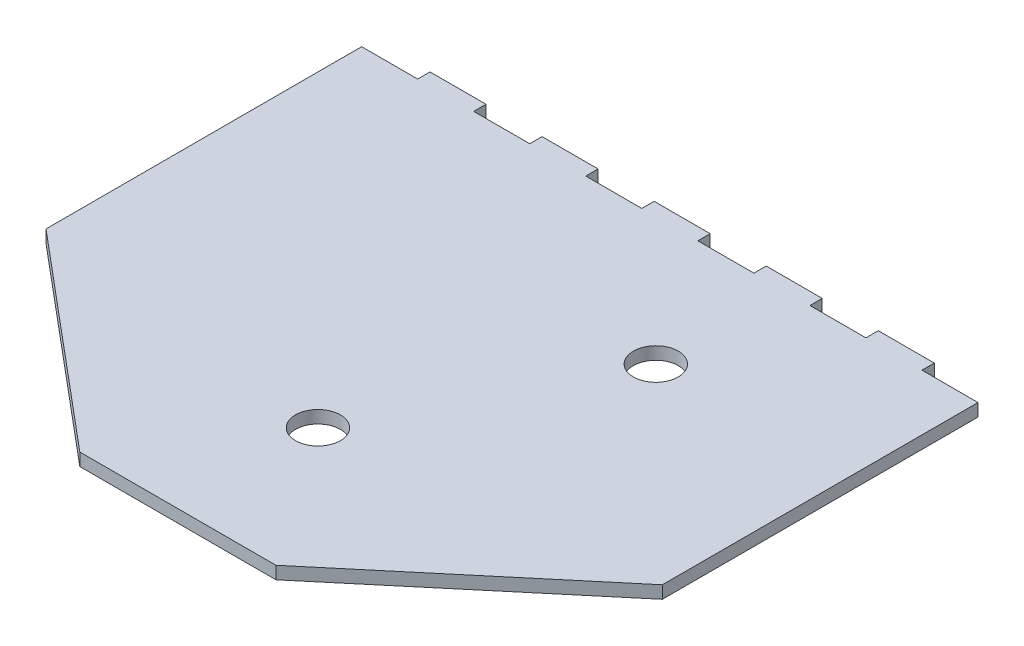
ISO-10303-21;
HEADER;
FILE_DESCRIPTION(('STEP AP214'),'2;1');
FILE_NAME('part.step','',(''),(''),'','','');
FILE_SCHEMA(('AUTOMOTIVE_DESIGN { 1 0 10303 214 1 1 1 1 }'));
ENDSEC;
DATA;
#1=APPLICATION_CONTEXT('core data for automotive mechanical design processes');
#2=APPLICATION_PROTOCOL_DEFINITION('international standard','automotive_design',2000,#1);
#3=PRODUCT_CONTEXT('',#1,'mechanical');
#4=PRODUCT('Part','Part','',(#3));
#5=PRODUCT_RELATED_PRODUCT_CATEGORY('part','',(#4));
#6=PRODUCT_DEFINITION_FORMATION('','',#4);
#7=PRODUCT_DEFINITION_CONTEXT('part definition',#1,'design');
#8=PRODUCT_DEFINITION('design','',#6,#7);
#9=PRODUCT_DEFINITION_SHAPE('','',#8);
#10=(LENGTH_UNIT() NAMED_UNIT(*) SI_UNIT(.MILLI.,.METRE.));
#11=(NAMED_UNIT(*) PLANE_ANGLE_UNIT() SI_UNIT($,.RADIAN.));
#12=(NAMED_UNIT(*) SI_UNIT($,.STERADIAN.) SOLID_ANGLE_UNIT());
#13=UNCERTAINTY_MEASURE_WITH_UNIT(LENGTH_MEASURE(1.E-05),#10,'distance_accuracy_value','');
#14=(GEOMETRIC_REPRESENTATION_CONTEXT(3) GLOBAL_UNCERTAINTY_ASSIGNED_CONTEXT((#13)) GLOBAL_UNIT_ASSIGNED_CONTEXT((#10,
#11,#12)) REPRESENTATION_CONTEXT('',''));
#15=CARTESIAN_POINT('',(0.,0.,0.));
#16=DIRECTION('',(0.,0.,1.));
#17=DIRECTION('',(1.,0.,0.));
#18=AXIS2_PLACEMENT_3D('',#15,#16,#17);
#19=CARTESIAN_POINT('',(110.,4.5,-90.));
#20=DIRECTION('',(0.,0.,1.));
#21=DIRECTION('',(1.,0.,0.));
#22=AXIS2_PLACEMENT_3D('',#19,#20,#21);
#23=PLANE('',#22);
#24=DIRECTION('',(-1.,0.,0.));
#25=VECTOR('',#24,1.);
#26=CARTESIAN_POINT('',(110.,4.5,-90.));
#27=LINE('',#26,#25);
#28=CARTESIAN_POINT('',(-70.,4.5,-90.0000000000003));
#29=VERTEX_POINT('',#28);
#30=CARTESIAN_POINT('',(-90.,4.5,-90.));
#31=VERTEX_POINT('',#30);
#32=EDGE_CURVE('E242',#29,#31,#27,.T.);
#33=ORIENTED_EDGE('',*,*,#32,.F.);
#34=DIRECTION('',(0.,-1.,0.));
#35=VECTOR('',#34,1.);
#36=CARTESIAN_POINT('',(-70.,4.5,-90.0000000000003));
#37=LINE('',#36,#35);
#38=CARTESIAN_POINT('',(-70.,0.,-90.0000000000003));
#39=VERTEX_POINT('',#38);
#40=EDGE_CURVE('E337',#29,#39,#37,.T.);
#41=ORIENTED_EDGE('',*,*,#40,.T.);
#42=DIRECTION('',(-1.,0.,0.));
#43=VECTOR('',#42,1.);
#44=CARTESIAN_POINT('',(110.,0.,-90.));
#45=LINE('',#44,#43);
#46=CARTESIAN_POINT('',(-90.,0.,-90.));
#47=VERTEX_POINT('',#46);
#48=EDGE_CURVE('E260',#39,#47,#45,.T.);
#49=ORIENTED_EDGE('',*,*,#48,.T.);
#50=DIRECTION('',(0.,-1.,0.));
#51=VECTOR('',#50,1.);
#52=CARTESIAN_POINT('',(-90.,4.5,-90.));
#53=LINE('',#52,#51);
#54=EDGE_CURVE('E409',#31,#47,#53,.T.);
#55=ORIENTED_EDGE('',*,*,#54,.F.);
#56=EDGE_LOOP('',(#33,#41,#49,#55));
#57=FACE_BOUND('',#56,.T.);
#58=ADVANCED_FACE('F41',(#57),#23,.F.);
#59=CARTESIAN_POINT('',(50.,0.,-90.0000000000003));
#60=VERTEX_POINT('',#59);
#61=CARTESIAN_POINT('',(30.,0.,-90.0000000000005));
#62=VERTEX_POINT('',#61);
#63=EDGE_CURVE('E435',#60,#62,#45,.T.);
#64=ORIENTED_EDGE('',*,*,#63,.T.);
#65=DIRECTION('',(0.,-1.,0.));
#66=VECTOR('',#65,1.);
#67=CARTESIAN_POINT('',(30.,4.5,-90.0000000000005));
#68=LINE('',#67,#66);
#69=CARTESIAN_POINT('',(30.,4.5,-90.0000000000005));
#70=VERTEX_POINT('',#69);
#71=EDGE_CURVE('E319',#70,#62,#68,.T.);
#72=ORIENTED_EDGE('',*,*,#71,.F.);
#73=CARTESIAN_POINT('',(50.,4.5,-90.0000000000003));
#74=VERTEX_POINT('',#73);
#75=EDGE_CURVE('E465',#74,#70,#27,.T.);
#76=ORIENTED_EDGE('',*,*,#75,.F.);
#77=DIRECTION('',(0.,-1.,0.));
#78=VECTOR('',#77,1.);
#79=CARTESIAN_POINT('',(50.,4.5,-90.0000000000003));
#80=LINE('',#79,#78);
#81=EDGE_CURVE('E391',#74,#60,#80,.T.);
#82=ORIENTED_EDGE('',*,*,#81,.T.);
#83=EDGE_LOOP('',(#64,#72,#76,#82));
#84=FACE_BOUND('',#83,.T.);
#85=ADVANCED_FACE('F480',(#84),#23,.F.);
#86=CARTESIAN_POINT('',(90.,4.5,-90.));
#87=VERTEX_POINT('',#86);
#88=CARTESIAN_POINT('',(70.,4.5,-90.0000000000003));
#89=VERTEX_POINT('',#88);
#90=EDGE_CURVE('E248',#87,#89,#27,.T.);
#91=ORIENTED_EDGE('',*,*,#90,.F.);
#92=DIRECTION('',(0.,-1.,0.));
#93=VECTOR('',#92,1.);
#94=CARTESIAN_POINT('',(90.,4.5,-90.));
#95=LINE('',#94,#93);
#96=CARTESIAN_POINT('',(90.,0.,-90.));
#97=VERTEX_POINT('',#96);
#98=EDGE_CURVE('E306',#87,#97,#95,.T.);
#99=ORIENTED_EDGE('',*,*,#98,.T.);
#100=CARTESIAN_POINT('',(70.,0.,-90.0000000000003));
#101=VERTEX_POINT('',#100);
#102=EDGE_CURVE('E264',#97,#101,#45,.T.);
#103=ORIENTED_EDGE('',*,*,#102,.T.);
#104=DIRECTION('',(0.,-1.,0.));
#105=VECTOR('',#104,1.);
#106=CARTESIAN_POINT('',(70.,4.5,-90.0000000000003));
#107=LINE('',#106,#105);
#108=EDGE_CURVE('E329',#89,#101,#107,.T.);
#109=ORIENTED_EDGE('',*,*,#108,.F.);
#110=EDGE_LOOP('',(#91,#99,#103,#109));
#111=FACE_BOUND('',#110,.T.);
#112=ADVANCED_FACE('F471',(#111),#23,.F.);
#113=CARTESIAN_POINT('',(-30.,0.,-90.0000000000005));
#114=VERTEX_POINT('',#113);
#115=CARTESIAN_POINT('',(-50.,0.,-90.));
#116=VERTEX_POINT('',#115);
#117=EDGE_CURVE('E263',#114,#116,#45,.T.);
#118=ORIENTED_EDGE('',*,*,#117,.T.);
#119=DIRECTION('',(0.,-1.,0.));
#120=VECTOR('',#119,1.);
#121=CARTESIAN_POINT('',(-50.,4.5,-90.0000000000003));
#122=LINE('',#121,#120);
#123=CARTESIAN_POINT('',(-50.,4.5,-90.0000000000003));
#124=VERTEX_POINT('',#123);
#125=EDGE_CURVE('E341',#124,#116,#122,.T.);
#126=ORIENTED_EDGE('',*,*,#125,.F.);
#127=CARTESIAN_POINT('',(-30.,4.5,-90.0000000000005));
#128=VERTEX_POINT('',#127);
#129=EDGE_CURVE('E246',#128,#124,#27,.T.);
#130=ORIENTED_EDGE('',*,*,#129,.F.);
#131=DIRECTION('',(0.,-1.,0.));
#132=VECTOR('',#131,1.);
#133=CARTESIAN_POINT('',(-30.,4.5,-90.0000000000005));
#134=LINE('',#133,#132);
#135=EDGE_CURVE('E363',#128,#114,#134,.T.);
#136=ORIENTED_EDGE('',*,*,#135,.T.);
#137=EDGE_LOOP('',(#118,#126,#130,#136));
#138=FACE_BOUND('',#137,.T.);
#139=ADVANCED_FACE('F451',(#138),#23,.F.);
#140=CARTESIAN_POINT('',(-110.,4.5,-90.));
#141=DIRECTION('',(1.,0.,0.));
#142=DIRECTION('',(0.,0.,-1.));
#143=AXIS2_PLACEMENT_3D('',#140,#141,#142);
#144=PLANE('',#143);
#145=DIRECTION('',(0.,0.,1.));
#146=VECTOR('',#145,1.);
#147=CARTESIAN_POINT('',(-110.,4.5,-90.));
#148=LINE('',#147,#146);
#149=CARTESIAN_POINT('',(-110.,4.5,-85.6));
#150=VERTEX_POINT('',#149);
#151=CARTESIAN_POINT('',(-110.,4.5,27.067527661704));
#152=VERTEX_POINT('',#151);
#153=EDGE_CURVE('E249',#150,#152,#148,.T.);
#154=ORIENTED_EDGE('',*,*,#153,.F.);
#155=DIRECTION('',(0.,-1.,0.));
#156=VECTOR('',#155,1.);
#157=CARTESIAN_POINT('',(-110.,4.5,-85.6));
#158=LINE('',#157,#156);
#159=CARTESIAN_POINT('',(-110.,0.,-85.6));
#160=VERTEX_POINT('',#159);
#161=EDGE_CURVE('E414',#150,#160,#158,.T.);
#162=ORIENTED_EDGE('',*,*,#161,.T.);
#163=DIRECTION('',(0.,0.,1.));
#164=VECTOR('',#163,1.);
#165=CARTESIAN_POINT('',(-110.,0.,-90.));
#166=LINE('',#165,#164);
#167=CARTESIAN_POINT('',(-110.,0.,27.067527661704));
#168=VERTEX_POINT('',#167);
#169=EDGE_CURVE('E253',#160,#168,#166,.T.);
#170=ORIENTED_EDGE('',*,*,#169,.T.);
#171=DIRECTION('',(0.,1.,0.));
#172=VECTOR('',#171,1.);
#173=CARTESIAN_POINT('',(-110.,4.5,27.067527661704));
#174=LINE('',#173,#172);
#175=EDGE_CURVE('E275',#168,#152,#174,.T.);
#176=ORIENTED_EDGE('',*,*,#175,.T.);
#177=EDGE_LOOP('',(#154,#162,#170,#176));
#178=FACE_BOUND('',#177,.T.);
#179=ADVANCED_FACE('F528',(#178),#144,.F.);
#180=CARTESIAN_POINT('',(110.,4.5,90.));
#181=DIRECTION('',(0.,0.,-1.));
#182=DIRECTION('',(-1.,0.,0.));
#183=AXIS2_PLACEMENT_3D('',#180,#181,#182);
#184=PLANE('',#183);
#185=DIRECTION('',(1.,0.,0.));
#186=VECTOR('',#185,1.);
#187=CARTESIAN_POINT('',(110.,4.5,90.));
#188=LINE('',#187,#186);
#189=CARTESIAN_POINT('',(-34.9999999999996,4.5,90.));
#190=VERTEX_POINT('',#189);
#191=CARTESIAN_POINT('',(34.9999999999998,4.5,90.));
#192=VERTEX_POINT('',#191);
#193=EDGE_CURVE('E243',#190,#192,#188,.T.);
#194=ORIENTED_EDGE('',*,*,#193,.F.);
#195=DIRECTION('',(0.,-1.,0.));
#196=VECTOR('',#195,1.);
#197=CARTESIAN_POINT('',(-34.9999999999996,4.5,90.));
#198=LINE('',#197,#196);
#199=CARTESIAN_POINT('',(-34.9999999999996,0.,90.));
#200=VERTEX_POINT('',#199);
#201=EDGE_CURVE('E267',#190,#200,#198,.T.);
#202=ORIENTED_EDGE('',*,*,#201,.T.);
#203=DIRECTION('',(1.,0.,0.));
#204=VECTOR('',#203,1.);
#205=CARTESIAN_POINT('',(110.,0.,90.));
#206=LINE('',#205,#204);
#207=CARTESIAN_POINT('',(34.9999999999998,0.,90.));
#208=VERTEX_POINT('',#207);
#209=EDGE_CURVE('E255',#200,#208,#206,.T.);
#210=ORIENTED_EDGE('',*,*,#209,.T.);
#211=DIRECTION('',(0.,1.,0.));
#212=VECTOR('',#211,1.);
#213=CARTESIAN_POINT('',(34.9999999999998,4.5,90.));
#214=LINE('',#213,#212);
#215=EDGE_CURVE('E265',#208,#192,#214,.T.);
#216=ORIENTED_EDGE('',*,*,#215,.T.);
#217=EDGE_LOOP('',(#194,#202,#210,#216));
#218=FACE_BOUND('',#217,.T.);
#219=ADVANCED_FACE('F286',(#218),#184,.F.);
#220=CARTESIAN_POINT('',(110.,4.5,-90.));
#221=DIRECTION('',(-1.,0.,0.));
#222=DIRECTION('',(0.,0.,1.));
#223=AXIS2_PLACEMENT_3D('',#220,#221,#222);
#224=PLANE('',#223);
#225=DIRECTION('',(0.,0.,-1.));
#226=VECTOR('',#225,1.);
#227=CARTESIAN_POINT('',(110.,0.,-90.));
#228=LINE('',#227,#226);
#229=CARTESIAN_POINT('',(110.,0.,27.067527661704));
#230=VERTEX_POINT('',#229);
#231=CARTESIAN_POINT('',(110.,0.,-85.6));
#232=VERTEX_POINT('',#231);
#233=EDGE_CURVE('E235',#230,#232,#228,.T.);
#234=ORIENTED_EDGE('',*,*,#233,.T.);
#235=DIRECTION('',(0.,-1.,0.));
#236=VECTOR('',#235,1.);
#237=CARTESIAN_POINT('',(110.,4.5,-85.6));
#238=LINE('',#237,#236);
#239=CARTESIAN_POINT('',(110.,4.5,-85.6));
#240=VERTEX_POINT('',#239);
#241=EDGE_CURVE('E218',#240,#232,#238,.T.);
#242=ORIENTED_EDGE('',*,*,#241,.F.);
#243=DIRECTION('',(0.,0.,-1.));
#244=VECTOR('',#243,1.);
#245=CARTESIAN_POINT('',(110.,4.5,-90.));
#246=LINE('',#245,#244);
#247=CARTESIAN_POINT('',(110.,4.5,27.067527661704));
#248=VERTEX_POINT('',#247);
#249=EDGE_CURVE('E232',#248,#240,#246,.T.);
#250=ORIENTED_EDGE('',*,*,#249,.F.);
#251=DIRECTION('',(0.,-1.,0.));
#252=VECTOR('',#251,1.);
#253=CARTESIAN_POINT('',(110.,4.5,27.067527661704));
#254=LINE('',#253,#252);
#255=EDGE_CURVE('E11',#248,#230,#254,.T.);
#256=ORIENTED_EDGE('',*,*,#255,.T.);
#257=EDGE_LOOP('',(#234,#242,#250,#256));
#258=FACE_BOUND('',#257,.T.);
#259=ADVANCED_FACE('F231',(#258),#224,.F.);
#260=CARTESIAN_POINT('',(9.99999999999998,4.5,-90.0000000000005));
#261=VERTEX_POINT('',#260);
#262=CARTESIAN_POINT('',(-9.99999999999998,4.5,-90.0000000000005));
#263=VERTEX_POINT('',#262);
#264=EDGE_CURVE('E463',#261,#263,#27,.T.);
#265=ORIENTED_EDGE('',*,*,#264,.F.);
#266=DIRECTION('',(0.,-1.,0.));
#267=VECTOR('',#266,1.);
#268=CARTESIAN_POINT('',(9.99999999999998,4.5,-90.0000000000005));
#269=LINE('',#268,#267);
#270=CARTESIAN_POINT('',(9.99999999999998,0.,-90.0000000000005));
#271=VERTEX_POINT('',#270);
#272=EDGE_CURVE('E316',#261,#271,#269,.T.);
#273=ORIENTED_EDGE('',*,*,#272,.T.);
#274=CARTESIAN_POINT('',(-9.99999999999998,0.,-90.));
#275=VERTEX_POINT('',#274);
#276=EDGE_CURVE('E439',#271,#275,#45,.T.);
#277=ORIENTED_EDGE('',*,*,#276,.T.);
#278=DIRECTION('',(0.,-1.,0.));
#279=VECTOR('',#278,1.);
#280=CARTESIAN_POINT('',(-9.99999999999998,4.5,-90.0000000000005));
#281=LINE('',#280,#279);
#282=EDGE_CURVE('E367',#263,#275,#281,.T.);
#283=ORIENTED_EDGE('',*,*,#282,.F.);
#284=EDGE_LOOP('',(#265,#273,#277,#283));
#285=FACE_BOUND('',#284,.T.);
#286=ADVANCED_FACE('F489',(#285),#23,.F.);
#287=CARTESIAN_POINT('',(0.,4.5,0.));
#288=DIRECTION('',(0.,-1.,0.));
#289=DIRECTION('',(0.,0.,-1.));
#290=AXIS2_PLACEMENT_3D('',#287,#288,#289);
#291=PLANE('',#290);
#292=DIRECTION('',(-1.,0.,0.));
#293=VECTOR('',#292,1.);
#294=CARTESIAN_POINT('',(110.,4.5,-85.6));
#295=LINE('',#294,#293);
#296=CARTESIAN_POINT('',(90.,4.5,-85.6));
#297=VERTEX_POINT('',#296);
#298=EDGE_CURVE('E214',#240,#297,#295,.T.);
#299=ORIENTED_EDGE('',*,*,#298,.T.);
#300=DIRECTION('',(0.,0.,-1.));
#301=VECTOR('',#300,1.);
#302=CARTESIAN_POINT('',(90.,4.5,-90.));
#303=LINE('',#302,#301);
#304=EDGE_CURVE('E225',#297,#87,#303,.T.);
#305=ORIENTED_EDGE('',*,*,#304,.T.);
#306=ORIENTED_EDGE('',*,*,#90,.T.);
#307=DIRECTION('',(0.,0.,1.));
#308=VECTOR('',#307,1.);
#309=CARTESIAN_POINT('',(70.,4.5,-90.0000000000003));
#310=LINE('',#309,#308);
#311=CARTESIAN_POINT('',(70.,4.5,-85.6000000000001));
#312=VERTEX_POINT('',#311);
#313=EDGE_CURVE('E398',#89,#312,#310,.T.);
#314=ORIENTED_EDGE('',*,*,#313,.T.);
#315=DIRECTION('',(-1.,0.,0.));
#316=VECTOR('',#315,1.);
#317=CARTESIAN_POINT('',(70.,4.5,-85.6000000000001));
#318=LINE('',#317,#316);
#319=CARTESIAN_POINT('',(50.,4.5,-85.6000000000003));
#320=VERTEX_POINT('',#319);
#321=EDGE_CURVE('E404',#312,#320,#318,.T.);
#322=ORIENTED_EDGE('',*,*,#321,.T.);
#323=DIRECTION('',(0.,0.,-1.));
#324=VECTOR('',#323,1.);
#325=CARTESIAN_POINT('',(50.,4.5,-90.0000000000003));
#326=LINE('',#325,#324);
#327=EDGE_CURVE('E388',#320,#74,#326,.T.);
#328=ORIENTED_EDGE('',*,*,#327,.T.);
#329=ORIENTED_EDGE('',*,*,#75,.T.);
#330=DIRECTION('',(0.,0.,1.));
#331=VECTOR('',#330,1.);
#332=CARTESIAN_POINT('',(30.,4.5,-90.0000000000005));
#333=LINE('',#332,#331);
#334=CARTESIAN_POINT('',(30.,4.5,-85.6000000000005));
#335=VERTEX_POINT('',#334);
#336=EDGE_CURVE('E325',#70,#335,#333,.T.);
#337=ORIENTED_EDGE('',*,*,#336,.T.);
#338=DIRECTION('',(-1.,0.,0.));
#339=VECTOR('',#338,1.);
#340=CARTESIAN_POINT('',(30.,4.5,-85.6000000000005));
#341=LINE('',#340,#339);
#342=CARTESIAN_POINT('',(9.99999999999998,4.5,-85.6000000000006));
#343=VERTEX_POINT('',#342);
#344=EDGE_CURVE('E332',#335,#343,#341,.T.);
#345=ORIENTED_EDGE('',*,*,#344,.T.);
#346=DIRECTION('',(0.,0.,-1.));
#347=VECTOR('',#346,1.);
#348=CARTESIAN_POINT('',(9.99999999999998,4.5,-90.0000000000005));
#349=LINE('',#348,#347);
#350=EDGE_CURVE('E313',#343,#261,#349,.T.);
#351=ORIENTED_EDGE('',*,*,#350,.T.);
#352=ORIENTED_EDGE('',*,*,#264,.T.);
#353=DIRECTION('',(0.,0.,1.));
#354=VECTOR('',#353,1.);
#355=CARTESIAN_POINT('',(-9.99999999999998,4.5,-90.0000000000005));
#356=LINE('',#355,#354);
#357=CARTESIAN_POINT('',(-9.99999999999998,4.5,-85.6000000000006));
#358=VERTEX_POINT('',#357);
#359=EDGE_CURVE('E381',#263,#358,#356,.T.);
#360=ORIENTED_EDGE('',*,*,#359,.T.);
#361=DIRECTION('',(-1.,0.,0.));
#362=VECTOR('',#361,1.);
#363=CARTESIAN_POINT('',(-30.,4.5,-85.6000000000005));
#364=LINE('',#363,#362);
#365=CARTESIAN_POINT('',(-30.,4.5,-85.6000000000005));
#366=VERTEX_POINT('',#365);
#367=EDGE_CURVE('E366',#358,#366,#364,.T.);
#368=ORIENTED_EDGE('',*,*,#367,.T.);
#369=DIRECTION('',(0.,0.,-1.));
#370=VECTOR('',#369,1.);
#371=CARTESIAN_POINT('',(-30.,4.5,-90.0000000000005));
#372=LINE('',#371,#370);
#373=EDGE_CURVE('E376',#366,#128,#372,.T.);
#374=ORIENTED_EDGE('',*,*,#373,.T.);
#375=ORIENTED_EDGE('',*,*,#129,.T.);
#376=DIRECTION('',(0.,0.,1.));
#377=VECTOR('',#376,1.);
#378=CARTESIAN_POINT('',(-50.,4.5,-90.0000000000003));
#379=LINE('',#378,#377);
#380=CARTESIAN_POINT('',(-50.,4.5,-85.6000000000003));
#381=VERTEX_POINT('',#380);
#382=EDGE_CURVE('E358',#124,#381,#379,.T.);
#383=ORIENTED_EDGE('',*,*,#382,.T.);
#384=DIRECTION('',(-1.,0.,0.));
#385=VECTOR('',#384,1.);
#386=CARTESIAN_POINT('',(-70.,4.5,-85.6000000000001));
#387=LINE('',#386,#385);
#388=CARTESIAN_POINT('',(-70.,4.5,-85.6000000000001));
#389=VERTEX_POINT('',#388);
#390=EDGE_CURVE('E340',#381,#389,#387,.T.);
#391=ORIENTED_EDGE('',*,*,#390,.T.);
#392=DIRECTION('',(0.,0.,-1.));
#393=VECTOR('',#392,1.);
#394=CARTESIAN_POINT('',(-70.,4.5,-90.0000000000003));
#395=LINE('',#394,#393);
#396=EDGE_CURVE('E352',#389,#29,#395,.T.);
#397=ORIENTED_EDGE('',*,*,#396,.T.);
#398=ORIENTED_EDGE('',*,*,#32,.T.);
#399=DIRECTION('',(0.,0.,1.));
#400=VECTOR('',#399,1.);
#401=CARTESIAN_POINT('',(-90.,4.5,-90.));
#402=LINE('',#401,#400);
#403=CARTESIAN_POINT('',(-90.,4.5,-85.6));
#404=VERTEX_POINT('',#403);
#405=EDGE_CURVE('E419',#31,#404,#402,.T.);
#406=ORIENTED_EDGE('',*,*,#405,.T.);
#407=DIRECTION('',(-1.,0.,0.));
#408=VECTOR('',#407,1.);
#409=CARTESIAN_POINT('',(-110.,4.5,-85.6));
#410=LINE('',#409,#408);
#411=EDGE_CURVE('E411',#404,#150,#410,.T.);
#412=ORIENTED_EDGE('',*,*,#411,.T.);
#413=ORIENTED_EDGE('',*,*,#153,.T.);
#414=DIRECTION('',(-0.76604444311898,0.,-0.642787609686537));
#415=VECTOR('',#414,1.);
#416=CARTESIAN_POINT('',(-34.9999999999996,4.5,90.));
#417=LINE('',#416,#415);
#418=EDGE_CURVE('E50',#152,#190,#417,.F.);
#419=ORIENTED_EDGE('',*,*,#418,.T.);
#420=ORIENTED_EDGE('',*,*,#193,.T.);
#421=DIRECTION('',(-0.766044443118979,0.,0.642787609686538));
#422=VECTOR('',#421,1.);
#423=CARTESIAN_POINT('',(110.,4.5,27.067527661704));
#424=LINE('',#423,#422);
#425=EDGE_CURVE('E241',#192,#248,#424,.F.);
#426=ORIENTED_EDGE('',*,*,#425,.T.);
#427=ORIENTED_EDGE('',*,*,#249,.T.);
#428=EDGE_LOOP('',(#299,#305,#306,#314,#322,#328,#329,#337,#345,#351,#352,#360,#368,#374,#375,
#383,#391,#397,#398,#406,#412,#413,#419,#420,#426,#427));
#429=FACE_BOUND('',#428,.T.);
#430=CARTESIAN_POINT('',(0.,4.5,40.));
#431=DIRECTION('',(0.,1.,0.));
#432=DIRECTION('',(0.,0.,1.));
#433=AXIS2_PLACEMENT_3D('',#430,#431,#432);
#434=CIRCLE('',#433,8.);
#435=CARTESIAN_POINT('',(0.,4.5,48.));
#436=VERTEX_POINT('',#435);
#437=EDGE_CURVE('E427',#436,#436,#434,.T.);
#438=ORIENTED_EDGE('',*,*,#437,.F.);
#439=EDGE_LOOP('',(#438));
#440=FACE_BOUND('',#439,.T.);
#441=CARTESIAN_POINT('',(40.6,4.5,-40.));
#442=DIRECTION('',(0.,1.,0.));
#443=DIRECTION('',(0.,0.,1.));
#444=AXIS2_PLACEMENT_3D('',#441,#442,#443);
#445=CIRCLE('',#444,8.);
#446=CARTESIAN_POINT('',(40.6,4.5,-32.));
#447=VERTEX_POINT('',#446);
#448=EDGE_CURVE('E430',#447,#447,#445,.T.);
#449=ORIENTED_EDGE('',*,*,#448,.F.);
#450=EDGE_LOOP('',(#449));
#451=FACE_BOUND('',#450,.T.);
#452=ADVANCED_FACE('F237',(#429,#440,#451),#291,.F.);
#453=CARTESIAN_POINT('',(0.,0.,0.));
#454=DIRECTION('',(0.,-1.,0.));
#455=DIRECTION('',(0.,0.,-1.));
#456=AXIS2_PLACEMENT_3D('',#453,#454,#455);
#457=PLANE('',#456);
#458=DIRECTION('',(0.,0.,-1.));
#459=VECTOR('',#458,1.);
#460=CARTESIAN_POINT('',(90.,0.,-90.));
#461=LINE('',#460,#459);
#462=CARTESIAN_POINT('',(90.,0.,-85.6));
#463=VERTEX_POINT('',#462);
#464=EDGE_CURVE('E226',#463,#97,#461,.T.);
#465=ORIENTED_EDGE('',*,*,#464,.F.);
#466=DIRECTION('',(-1.,0.,0.));
#467=VECTOR('',#466,1.);
#468=CARTESIAN_POINT('',(110.,0.,-85.6));
#469=LINE('',#468,#467);
#470=EDGE_CURVE('E297',#232,#463,#469,.T.);
#471=ORIENTED_EDGE('',*,*,#470,.F.);
#472=ORIENTED_EDGE('',*,*,#233,.F.);
#473=DIRECTION('',(0.766044443118979,0.,-0.642787609686538));
#474=VECTOR('',#473,1.);
#475=CARTESIAN_POINT('',(58.7775057763779,0.,70.0483036727255));
#476=LINE('',#475,#474);
#477=EDGE_CURVE('E270',#230,#208,#476,.F.);
#478=ORIENTED_EDGE('',*,*,#477,.T.);
#479=ORIENTED_EDGE('',*,*,#209,.F.);
#480=DIRECTION('',(0.76604444311898,0.,0.642787609686537));
#481=VECTOR('',#480,1.);
#482=CARTESIAN_POINT('',(-58.7775057763778,0.,70.0483036727255));
#483=LINE('',#482,#481);
#484=EDGE_CURVE('E272',#200,#168,#483,.F.);
#485=ORIENTED_EDGE('',*,*,#484,.T.);
#486=ORIENTED_EDGE('',*,*,#169,.F.);
#487=DIRECTION('',(-1.,0.,0.));
#488=VECTOR('',#487,1.);
#489=CARTESIAN_POINT('',(-110.,0.,-85.6));
#490=LINE('',#489,#488);
#491=CARTESIAN_POINT('',(-90.,0.,-85.6));
#492=VERTEX_POINT('',#491);
#493=EDGE_CURVE('E417',#492,#160,#490,.T.);
#494=ORIENTED_EDGE('',*,*,#493,.F.);
#495=DIRECTION('',(0.,0.,1.));
#496=VECTOR('',#495,1.);
#497=CARTESIAN_POINT('',(-90.,0.,-90.));
#498=LINE('',#497,#496);
#499=EDGE_CURVE('E347',#47,#492,#498,.T.);
#500=ORIENTED_EDGE('',*,*,#499,.F.);
#501=ORIENTED_EDGE('',*,*,#48,.F.);
#502=DIRECTION('',(0.,0.,-1.));
#503=VECTOR('',#502,1.);
#504=CARTESIAN_POINT('',(-70.,0.,-90.0000000000003));
#505=LINE('',#504,#503);
#506=CARTESIAN_POINT('',(-70.,0.,-85.6000000000001));
#507=VERTEX_POINT('',#506);
#508=EDGE_CURVE('E321',#507,#39,#505,.T.);
#509=ORIENTED_EDGE('',*,*,#508,.F.);
#510=DIRECTION('',(-1.,0.,0.));
#511=VECTOR('',#510,1.);
#512=CARTESIAN_POINT('',(-70.,0.,-85.6000000000001));
#513=LINE('',#512,#511);
#514=CARTESIAN_POINT('',(-50.,0.,-85.6000000000003));
#515=VERTEX_POINT('',#514);
#516=EDGE_CURVE('E348',#515,#507,#513,.T.);
#517=ORIENTED_EDGE('',*,*,#516,.F.);
#518=DIRECTION('',(0.,0.,1.));
#519=VECTOR('',#518,1.);
#520=CARTESIAN_POINT('',(-50.,0.,-90.0000000000003));
#521=LINE('',#520,#519);
#522=EDGE_CURVE('E351',#116,#515,#521,.T.);
#523=ORIENTED_EDGE('',*,*,#522,.F.);
#524=ORIENTED_EDGE('',*,*,#117,.F.);
#525=DIRECTION('',(0.,0.,-1.));
#526=VECTOR('',#525,1.);
#527=CARTESIAN_POINT('',(-30.,0.,-90.0000000000005));
#528=LINE('',#527,#526);
#529=CARTESIAN_POINT('',(-30.,0.,-85.6000000000005));
#530=VERTEX_POINT('',#529);
#531=EDGE_CURVE('E299',#530,#114,#528,.T.);
#532=ORIENTED_EDGE('',*,*,#531,.F.);
#533=DIRECTION('',(-1.,0.,0.));
#534=VECTOR('',#533,1.);
#535=CARTESIAN_POINT('',(-30.,0.,-85.6000000000005));
#536=LINE('',#535,#534);
#537=CARTESIAN_POINT('',(-9.99999999999998,0.,-85.6000000000006));
#538=VERTEX_POINT('',#537);
#539=EDGE_CURVE('E373',#538,#530,#536,.T.);
#540=ORIENTED_EDGE('',*,*,#539,.F.);
#541=DIRECTION('',(0.,0.,1.));
#542=VECTOR('',#541,1.);
#543=CARTESIAN_POINT('',(-9.99999999999998,0.,-90.0000000000005));
#544=LINE('',#543,#542);
#545=EDGE_CURVE('E302',#275,#538,#544,.T.);
#546=ORIENTED_EDGE('',*,*,#545,.F.);
#547=ORIENTED_EDGE('',*,*,#276,.F.);
#548=DIRECTION('',(0.,0.,-1.));
#549=VECTOR('',#548,1.);
#550=CARTESIAN_POINT('',(9.99999999999998,0.,-90.0000000000005));
#551=LINE('',#550,#549);
#552=CARTESIAN_POINT('',(9.99999999999998,0.,-85.6000000000006));
#553=VERTEX_POINT('',#552);
#554=EDGE_CURVE('E322',#553,#271,#551,.T.);
#555=ORIENTED_EDGE('',*,*,#554,.F.);
#556=DIRECTION('',(-1.,0.,0.));
#557=VECTOR('',#556,1.);
#558=CARTESIAN_POINT('',(30.,0.,-85.6000000000005));
#559=LINE('',#558,#557);
#560=CARTESIAN_POINT('',(30.,0.,-85.6000000000005));
#561=VERTEX_POINT('',#560);
#562=EDGE_CURVE('E324',#561,#553,#559,.T.);
#563=ORIENTED_EDGE('',*,*,#562,.F.);
#564=DIRECTION('',(0.,0.,1.));
#565=VECTOR('',#564,1.);
#566=CARTESIAN_POINT('',(30.,0.,-90.0000000000005));
#567=LINE('',#566,#565);
#568=EDGE_CURVE('E57',#62,#561,#567,.T.);
#569=ORIENTED_EDGE('',*,*,#568,.F.);
#570=ORIENTED_EDGE('',*,*,#63,.F.);
#571=DIRECTION('',(0.,0.,-1.));
#572=VECTOR('',#571,1.);
#573=CARTESIAN_POINT('',(50.,0.,-90.0000000000003));
#574=LINE('',#573,#572);
#575=CARTESIAN_POINT('',(50.,0.,-85.6000000000003));
#576=VERTEX_POINT('',#575);
#577=EDGE_CURVE('E395',#576,#60,#574,.T.);
#578=ORIENTED_EDGE('',*,*,#577,.F.);
#579=DIRECTION('',(-1.,0.,0.));
#580=VECTOR('',#579,1.);
#581=CARTESIAN_POINT('',(70.,0.,-85.6000000000001));
#582=LINE('',#581,#580);
#583=CARTESIAN_POINT('',(70.,0.,-85.6000000000001));
#584=VERTEX_POINT('',#583);
#585=EDGE_CURVE('E397',#584,#576,#582,.T.);
#586=ORIENTED_EDGE('',*,*,#585,.F.);
#587=DIRECTION('',(0.,0.,1.));
#588=VECTOR('',#587,1.);
#589=CARTESIAN_POINT('',(70.,0.,-90.0000000000003));
#590=LINE('',#589,#588);
#591=EDGE_CURVE('E65',#101,#584,#590,.T.);
#592=ORIENTED_EDGE('',*,*,#591,.F.);
#593=ORIENTED_EDGE('',*,*,#102,.F.);
#594=EDGE_LOOP('',(#465,#471,#472,#478,#479,#485,#486,#494,#500,#501,#509,#517,#523,#524,#532,
#540,#546,#547,#555,#563,#569,#570,#578,#586,#592,#593));
#595=FACE_BOUND('',#594,.T.);
#596=CARTESIAN_POINT('',(0.,0.,40.));
#597=DIRECTION('',(0.,1.,0.));
#598=DIRECTION('',(0.,0.,1.));
#599=AXIS2_PLACEMENT_3D('',#596,#597,#598);
#600=CIRCLE('',#599,8.);
#601=CARTESIAN_POINT('',(0.,0.,48.));
#602=VERTEX_POINT('',#601);
#603=EDGE_CURVE('E256',#602,#602,#600,.T.);
#604=ORIENTED_EDGE('',*,*,#603,.T.);
#605=EDGE_LOOP('',(#604));
#606=FACE_BOUND('',#605,.T.);
#607=CARTESIAN_POINT('',(40.6,0.,-40.));
#608=DIRECTION('',(0.,1.,0.));
#609=DIRECTION('',(0.,0.,1.));
#610=AXIS2_PLACEMENT_3D('',#607,#608,#609);
#611=CIRCLE('',#610,8.);
#612=CARTESIAN_POINT('',(40.6,0.,-32.));
#613=VERTEX_POINT('',#612);
#614=EDGE_CURVE('E309',#613,#613,#611,.T.);
#615=ORIENTED_EDGE('',*,*,#614,.T.);
#616=EDGE_LOOP('',(#615));
#617=FACE_BOUND('',#616,.T.);
#618=ADVANCED_FACE('F293',(#595,#606,#617),#457,.T.);
#619=CARTESIAN_POINT('',(-34.9999999999996,4.5,90.));
#620=DIRECTION('',(0.642787609686537,0.,-0.76604444311898));
#621=DIRECTION('',(0.,-1.,0.));
#622=AXIS2_PLACEMENT_3D('',#619,#620,#621);
#623=PLANE('',#622);
#624=ORIENTED_EDGE('',*,*,#418,.F.);
#625=ORIENTED_EDGE('',*,*,#175,.F.);
#626=ORIENTED_EDGE('',*,*,#484,.F.);
#627=ORIENTED_EDGE('',*,*,#201,.F.);
#628=EDGE_LOOP('',(#624,#625,#626,#627));
#629=FACE_BOUND('',#628,.T.);
#630=ADVANCED_FACE('F289',(#629),#623,.F.);
#631=CARTESIAN_POINT('',(110.,4.5,27.067527661704));
#632=DIRECTION('',(-0.642787609686538,0.,-0.766044443118979));
#633=DIRECTION('',(0.,-1.,0.));
#634=AXIS2_PLACEMENT_3D('',#631,#632,#633);
#635=PLANE('',#634);
#636=ORIENTED_EDGE('',*,*,#425,.F.);
#637=ORIENTED_EDGE('',*,*,#215,.F.);
#638=ORIENTED_EDGE('',*,*,#477,.F.);
#639=ORIENTED_EDGE('',*,*,#255,.F.);
#640=EDGE_LOOP('',(#636,#637,#638,#639));
#641=FACE_BOUND('',#640,.T.);
#642=ADVANCED_FACE('F44',(#641),#635,.F.);
#643=CARTESIAN_POINT('',(40.6,0.,-40.));
#644=DIRECTION('',(0.,1.,0.));
#645=DIRECTION('',(0.,0.,1.));
#646=AXIS2_PLACEMENT_3D('',#643,#644,#645);
#647=CYLINDRICAL_SURFACE('',#646,8.);
#648=ORIENTED_EDGE('',*,*,#614,.F.);
#649=EDGE_LOOP('',(#648));
#650=FACE_BOUND('',#649,.T.);
#651=ORIENTED_EDGE('',*,*,#448,.T.);
#652=EDGE_LOOP('',(#651));
#653=FACE_BOUND('',#652,.T.);
#654=ADVANCED_FACE('F682',(#650,#653),#647,.F.);
#655=CARTESIAN_POINT('',(0.,0.,40.));
#656=DIRECTION('',(0.,1.,0.));
#657=DIRECTION('',(0.,0.,1.));
#658=AXIS2_PLACEMENT_3D('',#655,#656,#657);
#659=CYLINDRICAL_SURFACE('',#658,8.);
#660=ORIENTED_EDGE('',*,*,#603,.F.);
#661=EDGE_LOOP('',(#660));
#662=FACE_BOUND('',#661,.T.);
#663=ORIENTED_EDGE('',*,*,#437,.T.);
#664=EDGE_LOOP('',(#663));
#665=FACE_BOUND('',#664,.T.);
#666=ADVANCED_FACE('F554',(#662,#665),#659,.F.);
#667=CARTESIAN_POINT('',(-110.,4.5,-85.6));
#668=DIRECTION('',(0.,0.,1.));
#669=DIRECTION('',(1.,0.,0.));
#670=AXIS2_PLACEMENT_3D('',#667,#668,#669);
#671=PLANE('',#670);
#672=ORIENTED_EDGE('',*,*,#493,.T.);
#673=ORIENTED_EDGE('',*,*,#161,.F.);
#674=ORIENTED_EDGE('',*,*,#411,.F.);
#675=DIRECTION('',(0.,-1.,0.));
#676=VECTOR('',#675,1.);
#677=CARTESIAN_POINT('',(-90.,4.5,-85.6));
#678=LINE('',#677,#676);
#679=EDGE_CURVE('E412',#404,#492,#678,.T.);
#680=ORIENTED_EDGE('',*,*,#679,.T.);
#681=EDGE_LOOP('',(#672,#673,#674,#680));
#682=FACE_BOUND('',#681,.T.);
#683=ADVANCED_FACE('F506',(#682),#671,.F.);
#684=CARTESIAN_POINT('',(-90.,4.5,-90.));
#685=DIRECTION('',(1.,0.,0.));
#686=DIRECTION('',(0.,0.,-1.));
#687=AXIS2_PLACEMENT_3D('',#684,#685,#686);
#688=PLANE('',#687);
#689=ORIENTED_EDGE('',*,*,#499,.T.);
#690=ORIENTED_EDGE('',*,*,#679,.F.);
#691=ORIENTED_EDGE('',*,*,#405,.F.);
#692=ORIENTED_EDGE('',*,*,#54,.T.);
#693=EDGE_LOOP('',(#689,#690,#691,#692));
#694=FACE_BOUND('',#693,.T.);
#695=ADVANCED_FACE('F499',(#694),#688,.F.);
#696=CARTESIAN_POINT('',(-30.,4.5,-90.0000000000005));
#697=DIRECTION('',(-1.,0.,0.));
#698=DIRECTION('',(0.,0.,1.));
#699=AXIS2_PLACEMENT_3D('',#696,#697,#698);
#700=PLANE('',#699);
#701=ORIENTED_EDGE('',*,*,#531,.T.);
#702=ORIENTED_EDGE('',*,*,#135,.F.);
#703=ORIENTED_EDGE('',*,*,#373,.F.);
#704=DIRECTION('',(0.,-1.,0.));
#705=VECTOR('',#704,1.);
#706=CARTESIAN_POINT('',(-30.,4.5,-85.6000000000005));
#707=LINE('',#706,#705);
#708=EDGE_CURVE('E371',#366,#530,#707,.T.);
#709=ORIENTED_EDGE('',*,*,#708,.T.);
#710=EDGE_LOOP('',(#701,#702,#703,#709));
#711=FACE_BOUND('',#710,.T.);
#712=ADVANCED_FACE('F497',(#711),#700,.F.);
#713=CARTESIAN_POINT('',(-30.,4.5,-85.6000000000005));
#714=DIRECTION('',(0.,0.,1.));
#715=DIRECTION('',(1.,0.,0.));
#716=AXIS2_PLACEMENT_3D('',#713,#714,#715);
#717=PLANE('',#716);
#718=ORIENTED_EDGE('',*,*,#539,.T.);
#719=ORIENTED_EDGE('',*,*,#708,.F.);
#720=ORIENTED_EDGE('',*,*,#367,.F.);
#721=DIRECTION('',(0.,-1.,0.));
#722=VECTOR('',#721,1.);
#723=CARTESIAN_POINT('',(-9.99999999999998,4.5,-85.6000000000006));
#724=LINE('',#723,#722);
#725=EDGE_CURVE('E369',#358,#538,#724,.T.);
#726=ORIENTED_EDGE('',*,*,#725,.T.);
#727=EDGE_LOOP('',(#718,#719,#720,#726));
#728=FACE_BOUND('',#727,.T.);
#729=ADVANCED_FACE('F494',(#728),#717,.F.);
#730=CARTESIAN_POINT('',(-9.99999999999998,4.5,-90.0000000000005));
#731=DIRECTION('',(1.,0.,0.));
#732=DIRECTION('',(0.,0.,-1.));
#733=AXIS2_PLACEMENT_3D('',#730,#731,#732);
#734=PLANE('',#733);
#735=ORIENTED_EDGE('',*,*,#545,.T.);
#736=ORIENTED_EDGE('',*,*,#725,.F.);
#737=ORIENTED_EDGE('',*,*,#359,.F.);
#738=ORIENTED_EDGE('',*,*,#282,.T.);
#739=EDGE_LOOP('',(#735,#736,#737,#738));
#740=FACE_BOUND('',#739,.T.);
#741=ADVANCED_FACE('F492',(#740),#734,.F.);
#742=CARTESIAN_POINT('',(70.,4.5,-90.0000000000003));
#743=DIRECTION('',(1.,0.,0.));
#744=DIRECTION('',(0.,0.,-1.));
#745=AXIS2_PLACEMENT_3D('',#742,#743,#744);
#746=PLANE('',#745);
#747=ORIENTED_EDGE('',*,*,#591,.T.);
#748=DIRECTION('',(0.,-1.,0.));
#749=VECTOR('',#748,1.);
#750=CARTESIAN_POINT('',(70.,4.5,-85.6000000000001));
#751=LINE('',#750,#749);
#752=EDGE_CURVE('E386',#312,#584,#751,.T.);
#753=ORIENTED_EDGE('',*,*,#752,.F.);
#754=ORIENTED_EDGE('',*,*,#313,.F.);
#755=ORIENTED_EDGE('',*,*,#108,.T.);
#756=EDGE_LOOP('',(#747,#753,#754,#755));
#757=FACE_BOUND('',#756,.T.);
#758=ADVANCED_FACE('F472',(#757),#746,.F.);
#759=CARTESIAN_POINT('',(50.,4.5,-90.0000000000003));
#760=DIRECTION('',(-1.,0.,0.));
#761=DIRECTION('',(0.,0.,1.));
#762=AXIS2_PLACEMENT_3D('',#759,#760,#761);
#763=PLANE('',#762);
#764=ORIENTED_EDGE('',*,*,#577,.T.);
#765=ORIENTED_EDGE('',*,*,#81,.F.);
#766=ORIENTED_EDGE('',*,*,#327,.F.);
#767=DIRECTION('',(0.,-1.,0.));
#768=VECTOR('',#767,1.);
#769=CARTESIAN_POINT('',(50.,4.5,-85.6000000000003));
#770=LINE('',#769,#768);
#771=EDGE_CURVE('E389',#320,#576,#770,.T.);
#772=ORIENTED_EDGE('',*,*,#771,.T.);
#773=EDGE_LOOP('',(#764,#765,#766,#772));
#774=FACE_BOUND('',#773,.T.);
#775=ADVANCED_FACE('F583',(#774),#763,.F.);
#776=CARTESIAN_POINT('',(70.,4.5,-85.6000000000001));
#777=DIRECTION('',(0.,0.,1.));
#778=DIRECTION('',(1.,0.,0.));
#779=AXIS2_PLACEMENT_3D('',#776,#777,#778);
#780=PLANE('',#779);
#781=ORIENTED_EDGE('',*,*,#585,.T.);
#782=ORIENTED_EDGE('',*,*,#771,.F.);
#783=ORIENTED_EDGE('',*,*,#321,.F.);
#784=ORIENTED_EDGE('',*,*,#752,.T.);
#785=EDGE_LOOP('',(#781,#782,#783,#784));
#786=FACE_BOUND('',#785,.T.);
#787=ADVANCED_FACE('F476',(#786),#780,.F.);
#788=CARTESIAN_POINT('',(30.,4.5,-90.0000000000005));
#789=DIRECTION('',(1.,0.,0.));
#790=DIRECTION('',(0.,0.,-1.));
#791=AXIS2_PLACEMENT_3D('',#788,#789,#790);
#792=PLANE('',#791);
#793=ORIENTED_EDGE('',*,*,#568,.T.);
#794=DIRECTION('',(0.,-1.,0.));
#795=VECTOR('',#794,1.);
#796=CARTESIAN_POINT('',(30.,4.5,-85.6000000000005));
#797=LINE('',#796,#795);
#798=EDGE_CURVE('E311',#335,#561,#797,.T.);
#799=ORIENTED_EDGE('',*,*,#798,.F.);
#800=ORIENTED_EDGE('',*,*,#336,.F.);
#801=ORIENTED_EDGE('',*,*,#71,.T.);
#802=EDGE_LOOP('',(#793,#799,#800,#801));
#803=FACE_BOUND('',#802,.T.);
#804=ADVANCED_FACE('F481',(#803),#792,.F.);
#805=CARTESIAN_POINT('',(9.99999999999998,4.5,-90.0000000000005));
#806=DIRECTION('',(-1.,0.,0.));
#807=DIRECTION('',(0.,0.,1.));
#808=AXIS2_PLACEMENT_3D('',#805,#806,#807);
#809=PLANE('',#808);
#810=ORIENTED_EDGE('',*,*,#554,.T.);
#811=ORIENTED_EDGE('',*,*,#272,.F.);
#812=ORIENTED_EDGE('',*,*,#350,.F.);
#813=DIRECTION('',(0.,-1.,0.));
#814=VECTOR('',#813,1.);
#815=CARTESIAN_POINT('',(9.99999999999998,4.5,-85.6000000000006));
#816=LINE('',#815,#814);
#817=EDGE_CURVE('E314',#343,#553,#816,.T.);
#818=ORIENTED_EDGE('',*,*,#817,.T.);
#819=EDGE_LOOP('',(#810,#811,#812,#818));
#820=FACE_BOUND('',#819,.T.);
#821=ADVANCED_FACE('F605',(#820),#809,.F.);
#822=CARTESIAN_POINT('',(30.,4.5,-85.6000000000005));
#823=DIRECTION('',(0.,0.,1.));
#824=DIRECTION('',(1.,0.,0.));
#825=AXIS2_PLACEMENT_3D('',#822,#823,#824);
#826=PLANE('',#825);
#827=ORIENTED_EDGE('',*,*,#562,.T.);
#828=ORIENTED_EDGE('',*,*,#817,.F.);
#829=ORIENTED_EDGE('',*,*,#344,.F.);
#830=ORIENTED_EDGE('',*,*,#798,.T.);
#831=EDGE_LOOP('',(#827,#828,#829,#830));
#832=FACE_BOUND('',#831,.T.);
#833=ADVANCED_FACE('F485',(#832),#826,.F.);
#834=CARTESIAN_POINT('',(-70.,4.5,-90.0000000000003));
#835=DIRECTION('',(-1.,0.,0.));
#836=DIRECTION('',(0.,0.,1.));
#837=AXIS2_PLACEMENT_3D('',#834,#835,#836);
#838=PLANE('',#837);
#839=ORIENTED_EDGE('',*,*,#508,.T.);
#840=ORIENTED_EDGE('',*,*,#40,.F.);
#841=ORIENTED_EDGE('',*,*,#396,.F.);
#842=DIRECTION('',(0.,-1.,0.));
#843=VECTOR('',#842,1.);
#844=CARTESIAN_POINT('',(-70.,4.5,-85.6000000000001));
#845=LINE('',#844,#843);
#846=EDGE_CURVE('E345',#389,#507,#845,.T.);
#847=ORIENTED_EDGE('',*,*,#846,.T.);
#848=EDGE_LOOP('',(#839,#840,#841,#847));
#849=FACE_BOUND('',#848,.T.);
#850=ADVANCED_FACE('F620',(#849),#838,.F.);
#851=CARTESIAN_POINT('',(-70.,4.5,-85.6000000000001));
#852=DIRECTION('',(0.,0.,1.));
#853=DIRECTION('',(1.,0.,0.));
#854=AXIS2_PLACEMENT_3D('',#851,#852,#853);
#855=PLANE('',#854);
#856=ORIENTED_EDGE('',*,*,#516,.T.);
#857=ORIENTED_EDGE('',*,*,#846,.F.);
#858=ORIENTED_EDGE('',*,*,#390,.F.);
#859=DIRECTION('',(0.,-1.,0.));
#860=VECTOR('',#859,1.);
#861=CARTESIAN_POINT('',(-50.,4.5,-85.6000000000003));
#862=LINE('',#861,#860);
#863=EDGE_CURVE('E343',#381,#515,#862,.T.);
#864=ORIENTED_EDGE('',*,*,#863,.T.);
#865=EDGE_LOOP('',(#856,#857,#858,#864));
#866=FACE_BOUND('',#865,.T.);
#867=ADVANCED_FACE('F628',(#866),#855,.F.);
#868=CARTESIAN_POINT('',(-50.,4.5,-90.0000000000003));
#869=DIRECTION('',(1.,0.,0.));
#870=DIRECTION('',(0.,0.,-1.));
#871=AXIS2_PLACEMENT_3D('',#868,#869,#870);
#872=PLANE('',#871);
#873=ORIENTED_EDGE('',*,*,#522,.T.);
#874=ORIENTED_EDGE('',*,*,#863,.F.);
#875=ORIENTED_EDGE('',*,*,#382,.F.);
#876=ORIENTED_EDGE('',*,*,#125,.T.);
#877=EDGE_LOOP('',(#873,#874,#875,#876));
#878=FACE_BOUND('',#877,.T.);
#879=ADVANCED_FACE('F460',(#878),#872,.F.);
#880=CARTESIAN_POINT('',(90.,4.5,-90.));
#881=DIRECTION('',(-1.,0.,0.));
#882=DIRECTION('',(0.,0.,1.));
#883=AXIS2_PLACEMENT_3D('',#880,#881,#882);
#884=PLANE('',#883);
#885=ORIENTED_EDGE('',*,*,#464,.T.);
#886=ORIENTED_EDGE('',*,*,#98,.F.);
#887=ORIENTED_EDGE('',*,*,#304,.F.);
#888=DIRECTION('',(0.,-1.,0.));
#889=VECTOR('',#888,1.);
#890=CARTESIAN_POINT('',(90.,4.5,-85.6));
#891=LINE('',#890,#889);
#892=EDGE_CURVE('E220',#297,#463,#891,.T.);
#893=ORIENTED_EDGE('',*,*,#892,.T.);
#894=EDGE_LOOP('',(#885,#886,#887,#893));
#895=FACE_BOUND('',#894,.T.);
#896=ADVANCED_FACE('F644',(#895),#884,.F.);
#897=CARTESIAN_POINT('',(110.,4.5,-85.6));
#898=DIRECTION('',(0.,0.,1.));
#899=DIRECTION('',(1.,0.,0.));
#900=AXIS2_PLACEMENT_3D('',#897,#898,#899);
#901=PLANE('',#900);
#902=ORIENTED_EDGE('',*,*,#470,.T.);
#903=ORIENTED_EDGE('',*,*,#892,.F.);
#904=ORIENTED_EDGE('',*,*,#298,.F.);
#905=ORIENTED_EDGE('',*,*,#241,.T.);
#906=EDGE_LOOP('',(#902,#903,#904,#905));
#907=FACE_BOUND('',#906,.T.);
#908=ADVANCED_FACE('F217',(#907),#901,.F.);
#909=CLOSED_SHELL('',(#58,#85,#112,#139,#179,#219,#259,#286,#452,#618,#630,#642,#654,#666,#683,
#695,#712,#729,#741,#758,#775,#787,#804,#821,#833,#850,#867,#879,#896,#908));
#910=MANIFOLD_SOLID_BREP('B2',#909);
#911=ADVANCED_BREP_SHAPE_REPRESENTATION('',(#18,#910),#14);
#912=SHAPE_DEFINITION_REPRESENTATION(#9,#911);
ENDSEC;
END-ISO-10303-21;
